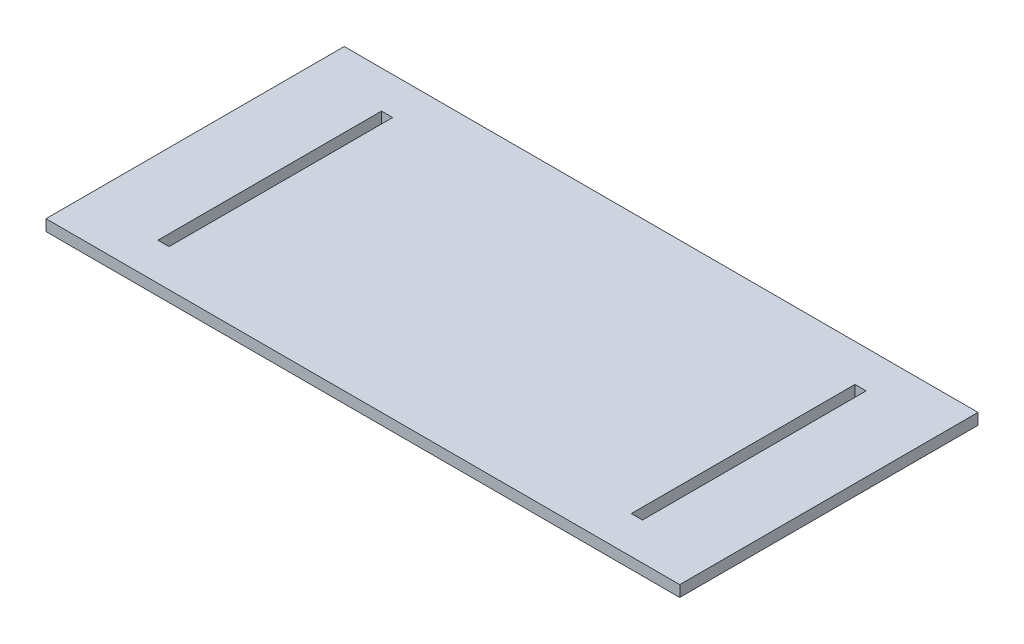
ISO-10303-21;
HEADER;
FILE_DESCRIPTION(('STEP AP214'),'2;1');
FILE_NAME('part.step','',(''),(''),'','','');
FILE_SCHEMA(('AUTOMOTIVE_DESIGN { 1 0 10303 214 1 1 1 1 }'));
ENDSEC;
DATA;
#1=APPLICATION_CONTEXT('core data for automotive mechanical design processes');
#2=APPLICATION_PROTOCOL_DEFINITION('international standard','automotive_design',2000,#1);
#3=PRODUCT_CONTEXT('',#1,'mechanical');
#4=PRODUCT('Part','Part','',(#3));
#5=PRODUCT_RELATED_PRODUCT_CATEGORY('part','',(#4));
#6=PRODUCT_DEFINITION_FORMATION('','',#4);
#7=PRODUCT_DEFINITION_CONTEXT('part definition',#1,'design');
#8=PRODUCT_DEFINITION('design','',#6,#7);
#9=PRODUCT_DEFINITION_SHAPE('','',#8);
#10=(LENGTH_UNIT() NAMED_UNIT(*) SI_UNIT(.MILLI.,.METRE.));
#11=(NAMED_UNIT(*) PLANE_ANGLE_UNIT() SI_UNIT($,.RADIAN.));
#12=(NAMED_UNIT(*) SI_UNIT($,.STERADIAN.) SOLID_ANGLE_UNIT());
#13=UNCERTAINTY_MEASURE_WITH_UNIT(LENGTH_MEASURE(1.E-05),#10,'distance_accuracy_value','');
#14=(GEOMETRIC_REPRESENTATION_CONTEXT(3) GLOBAL_UNCERTAINTY_ASSIGNED_CONTEXT((#13)) GLOBAL_UNIT_ASSIGNED_CONTEXT((#10,
#11,#12)) REPRESENTATION_CONTEXT('',''));
#15=CARTESIAN_POINT('',(0.,0.,0.));
#16=DIRECTION('',(0.,0.,1.));
#17=DIRECTION('',(1.,0.,0.));
#18=AXIS2_PLACEMENT_3D('',#15,#16,#17);
#19=CARTESIAN_POINT('',(0.,3.,0.));
#20=DIRECTION('',(0.,-1.,0.));
#21=DIRECTION('',(0.,0.,-1.));
#22=AXIS2_PLACEMENT_3D('',#19,#20,#21);
#23=PLANE('',#22);
#24=DIRECTION('',(1.,0.,0.));
#25=VECTOR('',#24,1.);
#26=CARTESIAN_POINT('',(0.,3.,-70.));
#27=LINE('',#26,#25);
#28=CARTESIAN_POINT('',(20.,3.,-70.));
#29=VERTEX_POINT('',#28);
#30=CARTESIAN_POINT('',(23.,3.,-70.));
#31=VERTEX_POINT('',#30);
#32=EDGE_CURVE('E216',#29,#31,#27,.T.);
#33=ORIENTED_EDGE('',*,*,#32,.T.);
#34=DIRECTION('',(0.,0.,1.));
#35=VECTOR('',#34,1.);
#36=CARTESIAN_POINT('',(23.,3.,0.));
#37=LINE('',#36,#35);
#38=CARTESIAN_POINT('',(23.,3.,-10.));
#39=VERTEX_POINT('',#38);
#40=EDGE_CURVE('E135',#31,#39,#37,.T.);
#41=ORIENTED_EDGE('',*,*,#40,.T.);
#42=DIRECTION('',(1.,0.,0.));
#43=VECTOR('',#42,1.);
#44=CARTESIAN_POINT('',(0.,3.,-10.));
#45=LINE('',#44,#43);
#46=CARTESIAN_POINT('',(20.,3.,-10.));
#47=VERTEX_POINT('',#46);
#48=EDGE_CURVE('E210',#47,#39,#45,.T.);
#49=ORIENTED_EDGE('',*,*,#48,.F.);
#50=DIRECTION('',(0.,0.,1.));
#51=VECTOR('',#50,1.);
#52=CARTESIAN_POINT('',(20.,3.,0.));
#53=LINE('',#52,#51);
#54=EDGE_CURVE('E213',#29,#47,#53,.T.);
#55=ORIENTED_EDGE('',*,*,#54,.F.);
#56=EDGE_LOOP('',(#33,#41,#49,#55));
#57=FACE_BOUND('',#56,.T.);
#58=DIRECTION('',(0.,0.,1.));
#59=VECTOR('',#58,1.);
#60=CARTESIAN_POINT('',(0.,3.,0.));
#61=LINE('',#60,#59);
#62=CARTESIAN_POINT('',(0.,3.,-80.));
#63=VERTEX_POINT('',#62);
#64=CARTESIAN_POINT('',(0.,3.,0.));
#65=VERTEX_POINT('',#64);
#66=EDGE_CURVE('E222',#63,#65,#61,.T.);
#67=ORIENTED_EDGE('',*,*,#66,.T.);
#68=DIRECTION('',(1.,0.,0.));
#69=VECTOR('',#68,1.);
#70=CARTESIAN_POINT('',(0.,3.,0.));
#71=LINE('',#70,#69);
#72=CARTESIAN_POINT('',(170.,3.,0.));
#73=VERTEX_POINT('',#72);
#74=EDGE_CURVE('E226',#65,#73,#71,.T.);
#75=ORIENTED_EDGE('',*,*,#74,.T.);
#76=DIRECTION('',(0.,0.,-1.));
#77=VECTOR('',#76,1.);
#78=CARTESIAN_POINT('',(170.,3.,0.));
#79=LINE('',#78,#77);
#80=CARTESIAN_POINT('',(170.,3.,-80.));
#81=VERTEX_POINT('',#80);
#82=EDGE_CURVE('E230',#73,#81,#79,.T.);
#83=ORIENTED_EDGE('',*,*,#82,.T.);
#84=DIRECTION('',(-1.,0.,0.));
#85=VECTOR('',#84,1.);
#86=CARTESIAN_POINT('',(0.,3.,-80.));
#87=LINE('',#86,#85);
#88=EDGE_CURVE('E233',#81,#63,#87,.T.);
#89=ORIENTED_EDGE('',*,*,#88,.T.);
#90=EDGE_LOOP('',(#67,#75,#83,#89));
#91=FACE_BOUND('',#90,.T.);
#92=DIRECTION('',(-1.,0.,0.));
#93=VECTOR('',#92,1.);
#94=CARTESIAN_POINT('',(0.,3.,-70.));
#95=LINE('',#94,#93);
#96=CARTESIAN_POINT('',(150.,3.,-70.));
#97=VERTEX_POINT('',#96);
#98=CARTESIAN_POINT('',(147.,3.,-70.));
#99=VERTEX_POINT('',#98);
#100=EDGE_CURVE('E207',#97,#99,#95,.T.);
#101=ORIENTED_EDGE('',*,*,#100,.F.);
#102=DIRECTION('',(0.,0.,1.));
#103=VECTOR('',#102,1.);
#104=CARTESIAN_POINT('',(150.,3.,0.));
#105=LINE('',#104,#103);
#106=CARTESIAN_POINT('',(150.,3.,-10.));
#107=VERTEX_POINT('',#106);
#108=EDGE_CURVE('E139',#97,#107,#105,.T.);
#109=ORIENTED_EDGE('',*,*,#108,.T.);
#110=DIRECTION('',(-1.,0.,0.));
#111=VECTOR('',#110,1.);
#112=CARTESIAN_POINT('',(0.,3.,-10.));
#113=LINE('',#112,#111);
#114=CARTESIAN_POINT('',(147.,3.,-10.));
#115=VERTEX_POINT('',#114);
#116=EDGE_CURVE('E200',#107,#115,#113,.T.);
#117=ORIENTED_EDGE('',*,*,#116,.T.);
#118=DIRECTION('',(0.,0.,1.));
#119=VECTOR('',#118,1.);
#120=CARTESIAN_POINT('',(147.,3.,0.));
#121=LINE('',#120,#119);
#122=EDGE_CURVE('E204',#99,#115,#121,.T.);
#123=ORIENTED_EDGE('',*,*,#122,.F.);
#124=EDGE_LOOP('',(#101,#109,#117,#123));
#125=FACE_BOUND('',#124,.T.);
#126=ADVANCED_FACE('F38',(#57,#91,#125),#23,.F.);
#127=CARTESIAN_POINT('',(0.,0.,0.));
#128=DIRECTION('',(0.,-1.,0.));
#129=DIRECTION('',(0.,0.,-1.));
#130=AXIS2_PLACEMENT_3D('',#127,#128,#129);
#131=PLANE('',#130);
#132=DIRECTION('',(0.,0.,1.));
#133=VECTOR('',#132,1.);
#134=CARTESIAN_POINT('',(23.,0.,0.));
#135=LINE('',#134,#133);
#136=CARTESIAN_POINT('',(23.,0.,-70.));
#137=VERTEX_POINT('',#136);
#138=CARTESIAN_POINT('',(23.,0.,-10.));
#139=VERTEX_POINT('',#138);
#140=EDGE_CURVE('E132',#137,#139,#135,.T.);
#141=ORIENTED_EDGE('',*,*,#140,.F.);
#142=DIRECTION('',(1.,0.,0.));
#143=VECTOR('',#142,1.);
#144=CARTESIAN_POINT('',(0.,0.,-70.));
#145=LINE('',#144,#143);
#146=CARTESIAN_POINT('',(20.,0.,-70.));
#147=VERTEX_POINT('',#146);
#148=EDGE_CURVE('E143',#147,#137,#145,.T.);
#149=ORIENTED_EDGE('',*,*,#148,.F.);
#150=DIRECTION('',(0.,0.,1.));
#151=VECTOR('',#150,1.);
#152=CARTESIAN_POINT('',(20.,0.,0.));
#153=LINE('',#152,#151);
#154=CARTESIAN_POINT('',(20.,0.,-10.));
#155=VERTEX_POINT('',#154);
#156=EDGE_CURVE('E150',#147,#155,#153,.T.);
#157=ORIENTED_EDGE('',*,*,#156,.T.);
#158=DIRECTION('',(1.,0.,0.));
#159=VECTOR('',#158,1.);
#160=CARTESIAN_POINT('',(0.,0.,-10.));
#161=LINE('',#160,#159);
#162=EDGE_CURVE('E155',#155,#139,#161,.T.);
#163=ORIENTED_EDGE('',*,*,#162,.T.);
#164=EDGE_LOOP('',(#141,#149,#157,#163));
#165=FACE_BOUND('',#164,.T.);
#166=DIRECTION('',(0.,0.,1.));
#167=VECTOR('',#166,1.);
#168=CARTESIAN_POINT('',(0.,0.,0.));
#169=LINE('',#168,#167);
#170=CARTESIAN_POINT('',(0.,0.,-80.));
#171=VERTEX_POINT('',#170);
#172=CARTESIAN_POINT('',(0.,0.,0.));
#173=VERTEX_POINT('',#172);
#174=EDGE_CURVE('E221',#171,#173,#169,.T.);
#175=ORIENTED_EDGE('',*,*,#174,.F.);
#176=DIRECTION('',(-1.,0.,0.));
#177=VECTOR('',#176,1.);
#178=CARTESIAN_POINT('',(0.,0.,-80.));
#179=LINE('',#178,#177);
#180=CARTESIAN_POINT('',(170.,0.,-80.));
#181=VERTEX_POINT('',#180);
#182=EDGE_CURVE('E227',#181,#171,#179,.T.);
#183=ORIENTED_EDGE('',*,*,#182,.F.);
#184=DIRECTION('',(0.,0.,-1.));
#185=VECTOR('',#184,1.);
#186=CARTESIAN_POINT('',(170.,0.,0.));
#187=LINE('',#186,#185);
#188=CARTESIAN_POINT('',(170.,0.,0.));
#189=VERTEX_POINT('',#188);
#190=EDGE_CURVE('E243',#189,#181,#187,.T.);
#191=ORIENTED_EDGE('',*,*,#190,.F.);
#192=DIRECTION('',(1.,0.,0.));
#193=VECTOR('',#192,1.);
#194=CARTESIAN_POINT('',(0.,0.,0.));
#195=LINE('',#194,#193);
#196=EDGE_CURVE('E240',#173,#189,#195,.T.);
#197=ORIENTED_EDGE('',*,*,#196,.F.);
#198=EDGE_LOOP('',(#175,#183,#191,#197));
#199=FACE_BOUND('',#198,.T.);
#200=DIRECTION('',(0.,0.,1.));
#201=VECTOR('',#200,1.);
#202=CARTESIAN_POINT('',(150.,0.,0.));
#203=LINE('',#202,#201);
#204=CARTESIAN_POINT('',(150.,0.,-70.));
#205=VERTEX_POINT('',#204);
#206=CARTESIAN_POINT('',(150.,0.,-10.));
#207=VERTEX_POINT('',#206);
#208=EDGE_CURVE('E186',#205,#207,#203,.T.);
#209=ORIENTED_EDGE('',*,*,#208,.F.);
#210=DIRECTION('',(-1.,0.,0.));
#211=VECTOR('',#210,1.);
#212=CARTESIAN_POINT('',(0.,0.,-70.));
#213=LINE('',#212,#211);
#214=CARTESIAN_POINT('',(147.,0.,-70.));
#215=VERTEX_POINT('',#214);
#216=EDGE_CURVE('E174',#205,#215,#213,.T.);
#217=ORIENTED_EDGE('',*,*,#216,.T.);
#218=DIRECTION('',(0.,0.,1.));
#219=VECTOR('',#218,1.);
#220=CARTESIAN_POINT('',(147.,0.,0.));
#221=LINE('',#220,#219);
#222=CARTESIAN_POINT('',(147.,0.,-10.));
#223=VERTEX_POINT('',#222);
#224=EDGE_CURVE('E178',#215,#223,#221,.T.);
#225=ORIENTED_EDGE('',*,*,#224,.T.);
#226=DIRECTION('',(-1.,0.,0.));
#227=VECTOR('',#226,1.);
#228=CARTESIAN_POINT('',(0.,0.,-10.));
#229=LINE('',#228,#227);
#230=EDGE_CURVE('E182',#207,#223,#229,.T.);
#231=ORIENTED_EDGE('',*,*,#230,.F.);
#232=EDGE_LOOP('',(#209,#217,#225,#231));
#233=FACE_BOUND('',#232,.T.);
#234=ADVANCED_FACE('F153',(#165,#199,#233),#131,.T.);
#235=CARTESIAN_POINT('',(0.,3.,0.));
#236=DIRECTION('',(1.,0.,0.));
#237=DIRECTION('',(0.,0.,-1.));
#238=AXIS2_PLACEMENT_3D('',#235,#236,#237);
#239=PLANE('',#238);
#240=ORIENTED_EDGE('',*,*,#174,.T.);
#241=DIRECTION('',(0.,-1.,0.));
#242=VECTOR('',#241,1.);
#243=CARTESIAN_POINT('',(0.,3.,0.));
#244=LINE('',#243,#242);
#245=EDGE_CURVE('E11',#65,#173,#244,.T.);
#246=ORIENTED_EDGE('',*,*,#245,.F.);
#247=ORIENTED_EDGE('',*,*,#66,.F.);
#248=DIRECTION('',(0.,-1.,0.));
#249=VECTOR('',#248,1.);
#250=CARTESIAN_POINT('',(0.,3.,-80.));
#251=LINE('',#250,#249);
#252=EDGE_CURVE('E236',#63,#171,#251,.T.);
#253=ORIENTED_EDGE('',*,*,#252,.T.);
#254=EDGE_LOOP('',(#240,#246,#247,#253));
#255=FACE_BOUND('',#254,.T.);
#256=ADVANCED_FACE('F40',(#255),#239,.F.);
#257=CARTESIAN_POINT('',(0.,3.,0.));
#258=DIRECTION('',(0.,0.,-1.));
#259=DIRECTION('',(-1.,0.,0.));
#260=AXIS2_PLACEMENT_3D('',#257,#258,#259);
#261=PLANE('',#260);
#262=ORIENTED_EDGE('',*,*,#196,.T.);
#263=DIRECTION('',(0.,-1.,0.));
#264=VECTOR('',#263,1.);
#265=CARTESIAN_POINT('',(170.,3.,0.));
#266=LINE('',#265,#264);
#267=EDGE_CURVE('E47',#73,#189,#266,.T.);
#268=ORIENTED_EDGE('',*,*,#267,.F.);
#269=ORIENTED_EDGE('',*,*,#74,.F.);
#270=ORIENTED_EDGE('',*,*,#245,.T.);
#271=EDGE_LOOP('',(#262,#268,#269,#270));
#272=FACE_BOUND('',#271,.T.);
#273=ADVANCED_FACE('F275',(#272),#261,.F.);
#274=CARTESIAN_POINT('',(170.,3.,0.));
#275=DIRECTION('',(-1.,0.,0.));
#276=DIRECTION('',(0.,0.,1.));
#277=AXIS2_PLACEMENT_3D('',#274,#275,#276);
#278=PLANE('',#277);
#279=ORIENTED_EDGE('',*,*,#190,.T.);
#280=DIRECTION('',(0.,-1.,0.));
#281=VECTOR('',#280,1.);
#282=CARTESIAN_POINT('',(170.,3.,-80.));
#283=LINE('',#282,#281);
#284=EDGE_CURVE('E251',#81,#181,#283,.T.);
#285=ORIENTED_EDGE('',*,*,#284,.F.);
#286=ORIENTED_EDGE('',*,*,#82,.F.);
#287=ORIENTED_EDGE('',*,*,#267,.T.);
#288=EDGE_LOOP('',(#279,#285,#286,#287));
#289=FACE_BOUND('',#288,.T.);
#290=ADVANCED_FACE('F260',(#289),#278,.F.);
#291=CARTESIAN_POINT('',(0.,3.,-80.));
#292=DIRECTION('',(0.,0.,1.));
#293=DIRECTION('',(1.,0.,0.));
#294=AXIS2_PLACEMENT_3D('',#291,#292,#293);
#295=PLANE('',#294);
#296=ORIENTED_EDGE('',*,*,#182,.T.);
#297=ORIENTED_EDGE('',*,*,#252,.F.);
#298=ORIENTED_EDGE('',*,*,#88,.F.);
#299=ORIENTED_EDGE('',*,*,#284,.T.);
#300=EDGE_LOOP('',(#296,#297,#298,#299));
#301=FACE_BOUND('',#300,.T.);
#302=ADVANCED_FACE('F268',(#301),#295,.F.);
#303=CARTESIAN_POINT('',(0.,10.,-70.));
#304=DIRECTION('',(0.,0.,1.));
#305=DIRECTION('',(1.,0.,0.));
#306=AXIS2_PLACEMENT_3D('',#303,#304,#305);
#307=PLANE('',#306);
#308=ORIENTED_EDGE('',*,*,#100,.T.);
#309=DIRECTION('',(0.,-1.,0.));
#310=VECTOR('',#309,1.);
#311=CARTESIAN_POINT('',(147.,10.,-70.));
#312=LINE('',#311,#310);
#313=EDGE_CURVE('E157',#99,#215,#312,.T.);
#314=ORIENTED_EDGE('',*,*,#313,.T.);
#315=ORIENTED_EDGE('',*,*,#216,.F.);
#316=DIRECTION('',(0.,-1.,0.));
#317=VECTOR('',#316,1.);
#318=CARTESIAN_POINT('',(150.,10.,-70.));
#319=LINE('',#318,#317);
#320=EDGE_CURVE('E189',#97,#205,#319,.T.);
#321=ORIENTED_EDGE('',*,*,#320,.F.);
#322=EDGE_LOOP('',(#308,#314,#315,#321));
#323=FACE_BOUND('',#322,.T.);
#324=ADVANCED_FACE('F290',(#323),#307,.T.);
#325=CARTESIAN_POINT('',(147.,10.,0.));
#326=DIRECTION('',(1.,0.,0.));
#327=DIRECTION('',(0.,0.,-1.));
#328=AXIS2_PLACEMENT_3D('',#325,#326,#327);
#329=PLANE('',#328);
#330=ORIENTED_EDGE('',*,*,#122,.T.);
#331=DIRECTION('',(0.,-1.,0.));
#332=VECTOR('',#331,1.);
#333=CARTESIAN_POINT('',(147.,10.,-10.));
#334=LINE('',#333,#332);
#335=EDGE_CURVE('E160',#115,#223,#334,.T.);
#336=ORIENTED_EDGE('',*,*,#335,.T.);
#337=ORIENTED_EDGE('',*,*,#224,.F.);
#338=ORIENTED_EDGE('',*,*,#313,.F.);
#339=EDGE_LOOP('',(#330,#336,#337,#338));
#340=FACE_BOUND('',#339,.T.);
#341=ADVANCED_FACE('F297',(#340),#329,.T.);
#342=CARTESIAN_POINT('',(0.,10.,-10.));
#343=DIRECTION('',(0.,0.,1.));
#344=DIRECTION('',(1.,0.,0.));
#345=AXIS2_PLACEMENT_3D('',#342,#343,#344);
#346=PLANE('',#345);
#347=DIRECTION('',(0.,-1.,0.));
#348=VECTOR('',#347,1.);
#349=CARTESIAN_POINT('',(150.,10.,-10.));
#350=LINE('',#349,#348);
#351=EDGE_CURVE('E62',#107,#207,#350,.T.);
#352=ORIENTED_EDGE('',*,*,#351,.T.);
#353=ORIENTED_EDGE('',*,*,#230,.T.);
#354=ORIENTED_EDGE('',*,*,#335,.F.);
#355=ORIENTED_EDGE('',*,*,#116,.F.);
#356=EDGE_LOOP('',(#352,#353,#354,#355));
#357=FACE_BOUND('',#356,.T.);
#358=ADVANCED_FACE('F302',(#357),#346,.F.);
#359=CARTESIAN_POINT('',(150.,10.,0.));
#360=DIRECTION('',(1.,0.,0.));
#361=DIRECTION('',(0.,0.,-1.));
#362=AXIS2_PLACEMENT_3D('',#359,#360,#361);
#363=PLANE('',#362);
#364=ORIENTED_EDGE('',*,*,#320,.T.);
#365=ORIENTED_EDGE('',*,*,#208,.T.);
#366=ORIENTED_EDGE('',*,*,#351,.F.);
#367=ORIENTED_EDGE('',*,*,#108,.F.);
#368=EDGE_LOOP('',(#364,#365,#366,#367));
#369=FACE_BOUND('',#368,.T.);
#370=ADVANCED_FACE('F313',(#369),#363,.F.);
#371=CARTESIAN_POINT('',(23.,10.,0.));
#372=DIRECTION('',(1.,0.,0.));
#373=DIRECTION('',(0.,0.,-1.));
#374=AXIS2_PLACEMENT_3D('',#371,#372,#373);
#375=PLANE('',#374);
#376=DIRECTION('',(0.,-1.,0.));
#377=VECTOR('',#376,1.);
#378=CARTESIAN_POINT('',(23.,10.,-70.));
#379=LINE('',#378,#377);
#380=EDGE_CURVE('E127',#31,#137,#379,.T.);
#381=ORIENTED_EDGE('',*,*,#380,.T.);
#382=ORIENTED_EDGE('',*,*,#140,.T.);
#383=DIRECTION('',(0.,-1.,0.));
#384=VECTOR('',#383,1.);
#385=CARTESIAN_POINT('',(23.,10.,-10.));
#386=LINE('',#385,#384);
#387=EDGE_CURVE('E167',#39,#139,#386,.T.);
#388=ORIENTED_EDGE('',*,*,#387,.F.);
#389=ORIENTED_EDGE('',*,*,#40,.F.);
#390=EDGE_LOOP('',(#381,#382,#388,#389));
#391=FACE_BOUND('',#390,.T.);
#392=ADVANCED_FACE('F129',(#391),#375,.F.);
#393=CARTESIAN_POINT('',(0.,10.,-70.));
#394=DIRECTION('',(0.,0.,-1.));
#395=DIRECTION('',(-1.,0.,0.));
#396=AXIS2_PLACEMENT_3D('',#393,#394,#395);
#397=PLANE('',#396);
#398=DIRECTION('',(0.,-1.,0.));
#399=VECTOR('',#398,1.);
#400=CARTESIAN_POINT('',(20.,10.,-70.));
#401=LINE('',#400,#399);
#402=EDGE_CURVE('E140',#29,#147,#401,.T.);
#403=ORIENTED_EDGE('',*,*,#402,.T.);
#404=ORIENTED_EDGE('',*,*,#148,.T.);
#405=ORIENTED_EDGE('',*,*,#380,.F.);
#406=ORIENTED_EDGE('',*,*,#32,.F.);
#407=EDGE_LOOP('',(#403,#404,#405,#406));
#408=FACE_BOUND('',#407,.T.);
#409=ADVANCED_FACE('F144',(#408),#397,.F.);
#410=CARTESIAN_POINT('',(20.,10.,0.));
#411=DIRECTION('',(1.,0.,0.));
#412=DIRECTION('',(0.,0.,-1.));
#413=AXIS2_PLACEMENT_3D('',#410,#411,#412);
#414=PLANE('',#413);
#415=ORIENTED_EDGE('',*,*,#54,.T.);
#416=DIRECTION('',(0.,-1.,0.));
#417=VECTOR('',#416,1.);
#418=CARTESIAN_POINT('',(20.,10.,-10.));
#419=LINE('',#418,#417);
#420=EDGE_CURVE('E54',#47,#155,#419,.T.);
#421=ORIENTED_EDGE('',*,*,#420,.T.);
#422=ORIENTED_EDGE('',*,*,#156,.F.);
#423=ORIENTED_EDGE('',*,*,#402,.F.);
#424=EDGE_LOOP('',(#415,#421,#422,#423));
#425=FACE_BOUND('',#424,.T.);
#426=ADVANCED_FACE('F325',(#425),#414,.T.);
#427=CARTESIAN_POINT('',(0.,10.,-10.));
#428=DIRECTION('',(0.,0.,-1.));
#429=DIRECTION('',(-1.,0.,0.));
#430=AXIS2_PLACEMENT_3D('',#427,#428,#429);
#431=PLANE('',#430);
#432=ORIENTED_EDGE('',*,*,#48,.T.);
#433=ORIENTED_EDGE('',*,*,#387,.T.);
#434=ORIENTED_EDGE('',*,*,#162,.F.);
#435=ORIENTED_EDGE('',*,*,#420,.F.);
#436=EDGE_LOOP('',(#432,#433,#434,#435));
#437=FACE_BOUND('',#436,.T.);
#438=ADVANCED_FACE('F328',(#437),#431,.T.);
#439=CLOSED_SHELL('',(#126,#234,#256,#273,#290,#302,#324,#341,#358,#370,#392,#409,#426,#438));
#440=MANIFOLD_SOLID_BREP('B2',#439);
#441=ADVANCED_BREP_SHAPE_REPRESENTATION('',(#18,#440),#14);
#442=SHAPE_DEFINITION_REPRESENTATION(#9,#441);
ENDSEC;
END-ISO-10303-21;
